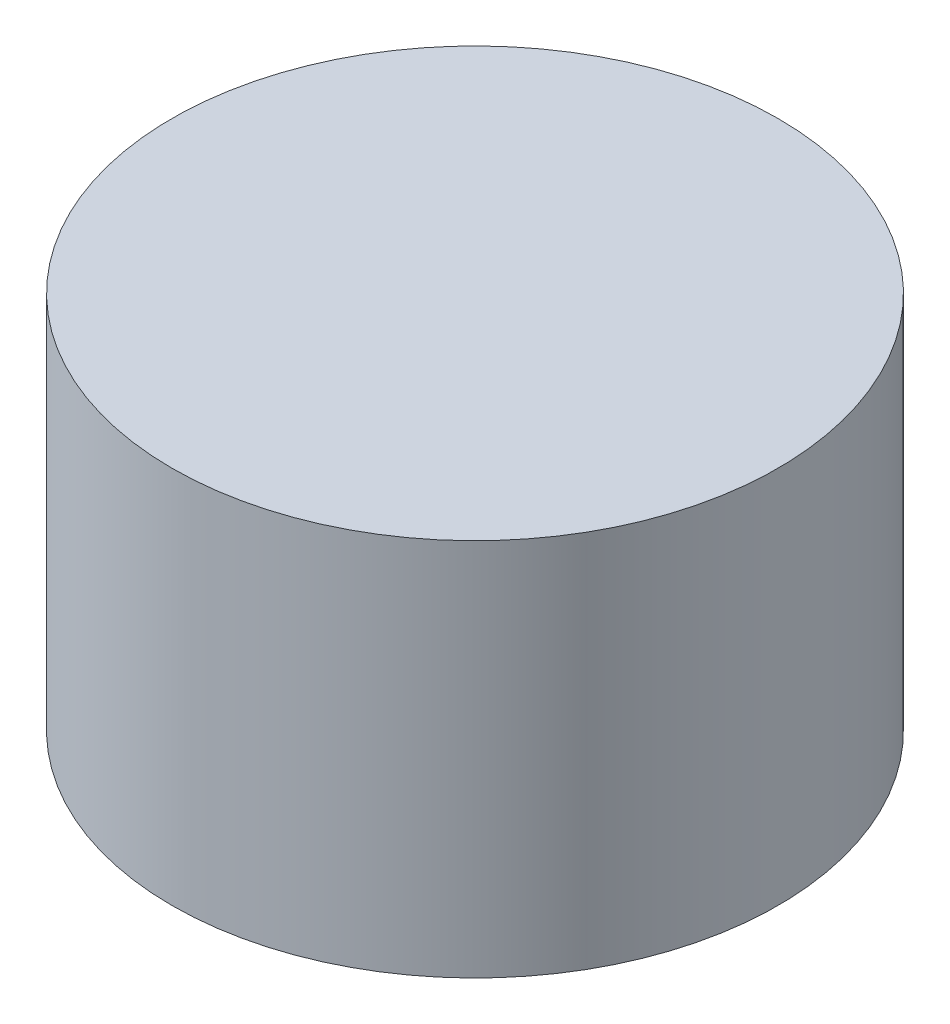
ISO-10303-21;
HEADER;
FILE_DESCRIPTION(('STEP AP214'),'2;1');
FILE_NAME('part.step','',(''),(''),'','','');
FILE_SCHEMA(('AUTOMOTIVE_DESIGN { 1 0 10303 214 1 1 1 1 }'));
ENDSEC;
DATA;
#1=APPLICATION_CONTEXT('core data for automotive mechanical design processes');
#2=APPLICATION_PROTOCOL_DEFINITION('international standard','automotive_design',2000,#1);
#3=PRODUCT_CONTEXT('',#1,'mechanical');
#4=PRODUCT('Part','Part','',(#3));
#5=PRODUCT_RELATED_PRODUCT_CATEGORY('part','',(#4));
#6=PRODUCT_DEFINITION_FORMATION('','',#4);
#7=PRODUCT_DEFINITION_CONTEXT('part definition',#1,'design');
#8=PRODUCT_DEFINITION('design','',#6,#7);
#9=PRODUCT_DEFINITION_SHAPE('','',#8);
#10=(LENGTH_UNIT() NAMED_UNIT(*) SI_UNIT(.MILLI.,.METRE.));
#11=(NAMED_UNIT(*) PLANE_ANGLE_UNIT() SI_UNIT($,.RADIAN.));
#12=(NAMED_UNIT(*) SI_UNIT($,.STERADIAN.) SOLID_ANGLE_UNIT());
#13=UNCERTAINTY_MEASURE_WITH_UNIT(LENGTH_MEASURE(1.E-05),#10,'distance_accuracy_value','');
#14=(GEOMETRIC_REPRESENTATION_CONTEXT(3) GLOBAL_UNCERTAINTY_ASSIGNED_CONTEXT((#13)) GLOBAL_UNIT_ASSIGNED_CONTEXT((#10,
#11,#12)) REPRESENTATION_CONTEXT('',''));
#15=CARTESIAN_POINT('',(0.,0.,0.));
#16=DIRECTION('',(0.,0.,1.));
#17=DIRECTION('',(1.,0.,0.));
#18=AXIS2_PLACEMENT_3D('',#15,#16,#17);
#19=CARTESIAN_POINT('',(0.,-5.,0.));
#20=DIRECTION('',(0.,1.,0.));
#21=DIRECTION('',(0.,0.,1.));
#22=AXIS2_PLACEMENT_3D('',#19,#20,#21);
#23=CYLINDRICAL_SURFACE('',#22,4.);
#24=CARTESIAN_POINT('',(0.,-5.,0.));
#25=DIRECTION('',(0.,1.,0.));
#26=DIRECTION('',(0.,0.,1.));
#27=AXIS2_PLACEMENT_3D('',#24,#25,#26);
#28=CIRCLE('',#27,4.);
#29=CARTESIAN_POINT('',(0.,-5.,4.));
#30=VERTEX_POINT('',#29);
#31=EDGE_CURVE('E10',#30,#30,#28,.T.);
#32=ORIENTED_EDGE('',*,*,#31,.T.);
#33=EDGE_LOOP('',(#32));
#34=FACE_BOUND('',#33,.T.);
#35=CARTESIAN_POINT('',(0.,0.,0.));
#36=DIRECTION('',(0.,1.,0.));
#37=DIRECTION('',(0.,0.,1.));
#38=AXIS2_PLACEMENT_3D('',#35,#36,#37);
#39=CIRCLE('',#38,4.);
#40=CARTESIAN_POINT('',(0.,0.,4.));
#41=VERTEX_POINT('',#40);
#42=EDGE_CURVE('E35',#41,#41,#39,.T.);
#43=ORIENTED_EDGE('',*,*,#42,.F.);
#44=EDGE_LOOP('',(#43));
#45=FACE_BOUND('',#44,.T.);
#46=ADVANCED_FACE('F32',(#34,#45),#23,.T.);
#47=CARTESIAN_POINT('',(0.,-5.,0.));
#48=DIRECTION('',(0.,1.,0.));
#49=DIRECTION('',(0.,0.,1.));
#50=AXIS2_PLACEMENT_3D('',#47,#48,#49);
#51=PLANE('',#50);
#52=ORIENTED_EDGE('',*,*,#31,.F.);
#53=EDGE_LOOP('',(#52));
#54=FACE_BOUND('',#53,.T.);
#55=ADVANCED_FACE('F47',(#54),#51,.F.);
#56=CARTESIAN_POINT('',(0.,0.,0.));
#57=DIRECTION('',(0.,1.,0.));
#58=DIRECTION('',(0.,0.,1.));
#59=AXIS2_PLACEMENT_3D('',#56,#57,#58);
#60=PLANE('',#59);
#61=ORIENTED_EDGE('',*,*,#42,.T.);
#62=EDGE_LOOP('',(#61));
#63=FACE_BOUND('',#62,.T.);
#64=ADVANCED_FACE('F44',(#63),#60,.T.);
#65=CLOSED_SHELL('',(#46,#55,#64));
#66=MANIFOLD_SOLID_BREP('B2',#65);
#67=ADVANCED_BREP_SHAPE_REPRESENTATION('',(#18,#66),#14);
#68=SHAPE_DEFINITION_REPRESENTATION(#9,#67);
ENDSEC;
END-ISO-10303-21;
